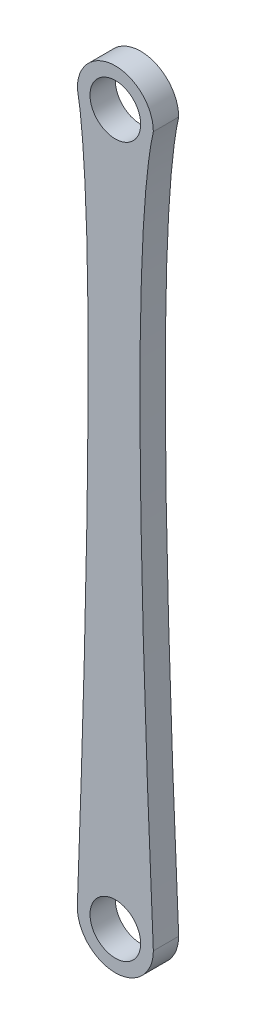
ISO-10303-21;
HEADER;
FILE_DESCRIPTION(('STEP AP214'),'2;1');
FILE_NAME('part.step','',(''),(''),'','','');
FILE_SCHEMA(('AUTOMOTIVE_DESIGN { 1 0 10303 214 1 1 1 1 }'));
ENDSEC;
DATA;
#1=APPLICATION_CONTEXT('core data for automotive mechanical design processes');
#2=APPLICATION_PROTOCOL_DEFINITION('international standard','automotive_design',2000,#1);
#3=PRODUCT_CONTEXT('',#1,'mechanical');
#4=PRODUCT('Part','Part','',(#3));
#5=PRODUCT_RELATED_PRODUCT_CATEGORY('part','',(#4));
#6=PRODUCT_DEFINITION_FORMATION('','',#4);
#7=PRODUCT_DEFINITION_CONTEXT('part definition',#1,'design');
#8=PRODUCT_DEFINITION('design','',#6,#7);
#9=PRODUCT_DEFINITION_SHAPE('','',#8);
#10=(LENGTH_UNIT() NAMED_UNIT(*) SI_UNIT(.MILLI.,.METRE.));
#11=(NAMED_UNIT(*) PLANE_ANGLE_UNIT() SI_UNIT($,.RADIAN.));
#12=(NAMED_UNIT(*) SI_UNIT($,.STERADIAN.) SOLID_ANGLE_UNIT());
#13=UNCERTAINTY_MEASURE_WITH_UNIT(LENGTH_MEASURE(1.E-05),#10,'distance_accuracy_value','');
#14=(GEOMETRIC_REPRESENTATION_CONTEXT(3) GLOBAL_UNCERTAINTY_ASSIGNED_CONTEXT((#13)) GLOBAL_UNIT_ASSIGNED_CONTEXT((#10,
#11,#12)) REPRESENTATION_CONTEXT('',''));
#15=CARTESIAN_POINT('',(0.,0.,0.));
#16=DIRECTION('',(0.,0.,1.));
#17=DIRECTION('',(1.,0.,0.));
#18=AXIS2_PLACEMENT_3D('',#15,#16,#17);
#19=CARTESIAN_POINT('',(-10.7113308739503,111.606684096733,10.));
#20=DIRECTION('',(0.,0.,1.));
#21=DIRECTION('',(1.,0.,0.));
#22=AXIS2_PLACEMENT_3D('',#19,#20,#21);
#23=PLANE('',#22);
#24=CARTESIAN_POINT('',(0.,-75.2678433281264,10.));
#25=DIRECTION('',(0.,0.,1.));
#26=DIRECTION('',(1.,0.,0.));
#27=AXIS2_PLACEMENT_3D('',#24,#25,#26);
#28=CIRCLE('',#27,10.);
#29=CARTESIAN_POINT('',(10.,-75.2678433281264,10.));
#30=VERTEX_POINT('',#29);
#31=EDGE_CURVE('E144',#30,#30,#28,.T.);
#32=ORIENTED_EDGE('',*,*,#31,.F.);
#33=EDGE_LOOP('',(#32));
#34=FACE_BOUND('',#33,.T.);
#35=CARTESIAN_POINT('',(-15.,204.732156671874,10.));
#36=CARTESIAN_POINT('',(-6.42266174790062,158.481211521592,10.));
#37=CARTESIAN_POINT('',(-15.,-75.2678433281266,10.));
#38=B_SPLINE_CURVE_WITH_KNOTS('',2,(#35,#36,#37),.UNSPECIFIED.,.F.,.F.,(3,3),(0.,1.),.UNSPECIFIED.);
#39=CARTESIAN_POINT('',(-15.,204.732156671874,10.));
#40=VERTEX_POINT('',#39);
#41=CARTESIAN_POINT('',(-15.,-75.2678433281264,10.));
#42=VERTEX_POINT('',#41);
#43=EDGE_CURVE('E86',#40,#42,#38,.T.);
#44=ORIENTED_EDGE('',*,*,#43,.T.);
#45=CARTESIAN_POINT('',(0.,-75.2678433281264,10.));
#46=DIRECTION('',(0.,0.,1.));
#47=DIRECTION('',(1.,0.,0.));
#48=AXIS2_PLACEMENT_3D('',#45,#46,#47);
#49=CIRCLE('',#48,15.);
#50=CARTESIAN_POINT('',(15.,-75.2678433281264,10.));
#51=VERTEX_POINT('',#50);
#52=EDGE_CURVE('E81',#42,#51,#49,.T.);
#53=ORIENTED_EDGE('',*,*,#52,.T.);
#54=CARTESIAN_POINT('',(15.,-75.2678433281264,10.));
#55=CARTESIAN_POINT('',(4.42383530771582,157.931962061811,10.));
#56=CARTESIAN_POINT('',(15.,204.732156671874,10.));
#57=B_SPLINE_CURVE_WITH_KNOTS('',2,(#54,#55,#56),.UNSPECIFIED.,.F.,.F.,(3,3),(0.,1.),.UNSPECIFIED.);
#58=CARTESIAN_POINT('',(15.,204.732156671874,10.));
#59=VERTEX_POINT('',#58);
#60=EDGE_CURVE('E84',#51,#59,#57,.T.);
#61=ORIENTED_EDGE('',*,*,#60,.T.);
#62=CARTESIAN_POINT('',(0.,204.732156671874,10.));
#63=DIRECTION('',(0.,0.,1.));
#64=DIRECTION('',(1.,0.,0.));
#65=AXIS2_PLACEMENT_3D('',#62,#63,#64);
#66=CIRCLE('',#65,15.);
#67=EDGE_CURVE('E51',#59,#40,#66,.T.);
#68=ORIENTED_EDGE('',*,*,#67,.T.);
#69=EDGE_LOOP('',(#44,#53,#61,#68));
#70=FACE_BOUND('',#69,.T.);
#71=CARTESIAN_POINT('',(0.,204.732156671874,10.));
#72=DIRECTION('',(0.,0.,1.));
#73=DIRECTION('',(1.,0.,0.));
#74=AXIS2_PLACEMENT_3D('',#71,#72,#73);
#75=CIRCLE('',#74,10.);
#76=CARTESIAN_POINT('',(9.99999999999997,204.732156671874,10.));
#77=VERTEX_POINT('',#76);
#78=EDGE_CURVE('E135',#77,#77,#75,.T.);
#79=ORIENTED_EDGE('',*,*,#78,.F.);
#80=EDGE_LOOP('',(#79));
#81=FACE_BOUND('',#80,.T.);
#82=ADVANCED_FACE('F33',(#34,#70,#81),#23,.T.);
#83=CARTESIAN_POINT('',(-10.7113308739503,111.606684096733,0.));
#84=DIRECTION('',(0.,0.,1.));
#85=DIRECTION('',(1.,0.,0.));
#86=AXIS2_PLACEMENT_3D('',#83,#84,#85);
#87=PLANE('',#86);
#88=CARTESIAN_POINT('',(-15.,204.732156671874,0.));
#89=CARTESIAN_POINT('',(-6.42266174790062,158.481211521592,0.));
#90=CARTESIAN_POINT('',(-15.,-75.2678433281266,0.));
#91=B_SPLINE_CURVE_WITH_KNOTS('',2,(#88,#89,#90),.UNSPECIFIED.,.F.,.F.,(3,3),(0.,1.),.UNSPECIFIED.);
#92=CARTESIAN_POINT('',(-15.,204.732156671874,0.));
#93=VERTEX_POINT('',#92);
#94=CARTESIAN_POINT('',(-15.,-75.2678433281264,0.));
#95=VERTEX_POINT('',#94);
#96=EDGE_CURVE('E147',#93,#95,#91,.T.);
#97=ORIENTED_EDGE('',*,*,#96,.F.);
#98=CARTESIAN_POINT('',(0.,204.732156671874,0.));
#99=DIRECTION('',(0.,0.,1.));
#100=DIRECTION('',(1.,0.,0.));
#101=AXIS2_PLACEMENT_3D('',#98,#99,#100);
#102=CIRCLE('',#101,15.);
#103=CARTESIAN_POINT('',(15.,204.732156671874,0.));
#104=VERTEX_POINT('',#103);
#105=EDGE_CURVE('E74',#104,#93,#102,.T.);
#106=ORIENTED_EDGE('',*,*,#105,.F.);
#107=CARTESIAN_POINT('',(15.,-75.2678433281264,0.));
#108=CARTESIAN_POINT('',(4.42383530771582,157.931962061811,0.));
#109=CARTESIAN_POINT('',(15.,204.732156671874,0.));
#110=B_SPLINE_CURVE_WITH_KNOTS('',2,(#107,#108,#109),.UNSPECIFIED.,.F.,.F.,(3,3),(0.,1.),.UNSPECIFIED.);
#111=CARTESIAN_POINT('',(15.,-75.2678433281264,0.));
#112=VERTEX_POINT('',#111);
#113=EDGE_CURVE('E68',#112,#104,#110,.T.);
#114=ORIENTED_EDGE('',*,*,#113,.F.);
#115=CARTESIAN_POINT('',(0.,-75.2678433281264,0.));
#116=DIRECTION('',(0.,0.,1.));
#117=DIRECTION('',(1.,0.,0.));
#118=AXIS2_PLACEMENT_3D('',#115,#116,#117);
#119=CIRCLE('',#118,15.);
#120=EDGE_CURVE('E90',#95,#112,#119,.T.);
#121=ORIENTED_EDGE('',*,*,#120,.F.);
#122=EDGE_LOOP('',(#97,#106,#114,#121));
#123=FACE_BOUND('',#122,.T.);
#124=CARTESIAN_POINT('',(0.,-75.2678433281264,0.));
#125=DIRECTION('',(0.,0.,1.));
#126=DIRECTION('',(1.,0.,0.));
#127=AXIS2_PLACEMENT_3D('',#124,#125,#126);
#128=CIRCLE('',#127,10.);
#129=CARTESIAN_POINT('',(10.,-75.2678433281264,0.));
#130=VERTEX_POINT('',#129);
#131=EDGE_CURVE('E141',#130,#130,#128,.T.);
#132=ORIENTED_EDGE('',*,*,#131,.T.);
#133=EDGE_LOOP('',(#132));
#134=FACE_BOUND('',#133,.T.);
#135=CARTESIAN_POINT('',(0.,204.732156671874,0.));
#136=DIRECTION('',(0.,0.,1.));
#137=DIRECTION('',(1.,0.,0.));
#138=AXIS2_PLACEMENT_3D('',#135,#136,#137);
#139=CIRCLE('',#138,10.);
#140=CARTESIAN_POINT('',(9.99999999999997,204.732156671874,0.));
#141=VERTEX_POINT('',#140);
#142=EDGE_CURVE('E138',#141,#141,#139,.T.);
#143=ORIENTED_EDGE('',*,*,#142,.T.);
#144=EDGE_LOOP('',(#143));
#145=FACE_BOUND('',#144,.T.);
#146=ADVANCED_FACE('F112',(#123,#134,#145),#87,.F.);
#147=DIRECTION('',(0.,0.,-1.));
#148=VECTOR('',#147,1.);
#149=SURFACE_OF_LINEAR_EXTRUSION('',#38,#148);
#150=ORIENTED_EDGE('',*,*,#96,.T.);
#151=DIRECTION('',(0.,0.,-1.));
#152=VECTOR('',#151,1.);
#153=CARTESIAN_POINT('',(-15.,-75.2678433281264,10.));
#154=LINE('',#153,#152);
#155=EDGE_CURVE('E11',#42,#95,#154,.T.);
#156=ORIENTED_EDGE('',*,*,#155,.F.);
#157=ORIENTED_EDGE('',*,*,#43,.F.);
#158=DIRECTION('',(0.,0.,-1.));
#159=VECTOR('',#158,1.);
#160=CARTESIAN_POINT('',(-15.,204.732156671874,10.));
#161=LINE('',#160,#159);
#162=EDGE_CURVE('E94',#40,#93,#161,.T.);
#163=ORIENTED_EDGE('',*,*,#162,.T.);
#164=EDGE_LOOP('',(#150,#156,#157,#163));
#165=FACE_BOUND('',#164,.T.);
#166=ADVANCED_FACE('F35',(#165),#149,.F.);
#167=CARTESIAN_POINT('',(0.,-75.2678433281264,10.));
#168=DIRECTION('',(0.,0.,-1.));
#169=DIRECTION('',(-1.,0.,0.));
#170=AXIS2_PLACEMENT_3D('',#167,#168,#169);
#171=CYLINDRICAL_SURFACE('',#170,15.);
#172=ORIENTED_EDGE('',*,*,#120,.T.);
#173=DIRECTION('',(0.,0.,-1.));
#174=VECTOR('',#173,1.);
#175=CARTESIAN_POINT('',(15.,-75.2678433281264,10.));
#176=LINE('',#175,#174);
#177=EDGE_CURVE('E43',#51,#112,#176,.T.);
#178=ORIENTED_EDGE('',*,*,#177,.F.);
#179=ORIENTED_EDGE('',*,*,#52,.F.);
#180=ORIENTED_EDGE('',*,*,#155,.T.);
#181=EDGE_LOOP('',(#172,#178,#179,#180));
#182=FACE_BOUND('',#181,.T.);
#183=ADVANCED_FACE('F89',(#182),#171,.T.);
#184=DIRECTION('',(0.,0.,-1.));
#185=VECTOR('',#184,1.);
#186=SURFACE_OF_LINEAR_EXTRUSION('',#57,#185);
#187=ORIENTED_EDGE('',*,*,#113,.T.);
#188=DIRECTION('',(0.,0.,-1.));
#189=VECTOR('',#188,1.);
#190=CARTESIAN_POINT('',(15.,204.732156671874,10.));
#191=LINE('',#190,#189);
#192=EDGE_CURVE('E91',#59,#104,#191,.T.);
#193=ORIENTED_EDGE('',*,*,#192,.F.);
#194=ORIENTED_EDGE('',*,*,#60,.F.);
#195=ORIENTED_EDGE('',*,*,#177,.T.);
#196=EDGE_LOOP('',(#187,#193,#194,#195));
#197=FACE_BOUND('',#196,.T.);
#198=ADVANCED_FACE('F92',(#197),#186,.F.);
#199=CARTESIAN_POINT('',(0.,204.732156671874,10.));
#200=DIRECTION('',(0.,0.,-1.));
#201=DIRECTION('',(-1.,0.,0.));
#202=AXIS2_PLACEMENT_3D('',#199,#200,#201);
#203=CYLINDRICAL_SURFACE('',#202,15.);
#204=ORIENTED_EDGE('',*,*,#105,.T.);
#205=ORIENTED_EDGE('',*,*,#162,.F.);
#206=ORIENTED_EDGE('',*,*,#67,.F.);
#207=ORIENTED_EDGE('',*,*,#192,.T.);
#208=EDGE_LOOP('',(#204,#205,#206,#207));
#209=FACE_BOUND('',#208,.T.);
#210=ADVANCED_FACE('F106',(#209),#203,.T.);
#211=CARTESIAN_POINT('',(0.,-75.2678433281264,10.));
#212=DIRECTION('',(0.,0.,-1.));
#213=DIRECTION('',(-1.,0.,0.));
#214=AXIS2_PLACEMENT_3D('',#211,#212,#213);
#215=CYLINDRICAL_SURFACE('',#214,10.);
#216=ORIENTED_EDGE('',*,*,#31,.T.);
#217=EDGE_LOOP('',(#216));
#218=FACE_BOUND('',#217,.T.);
#219=ORIENTED_EDGE('',*,*,#131,.F.);
#220=EDGE_LOOP('',(#219));
#221=FACE_BOUND('',#220,.T.);
#222=ADVANCED_FACE('F123',(#218,#221),#215,.F.);
#223=CARTESIAN_POINT('',(0.,204.732156671874,10.));
#224=DIRECTION('',(0.,0.,-1.));
#225=DIRECTION('',(-1.,0.,0.));
#226=AXIS2_PLACEMENT_3D('',#223,#224,#225);
#227=CYLINDRICAL_SURFACE('',#226,10.);
#228=ORIENTED_EDGE('',*,*,#78,.T.);
#229=EDGE_LOOP('',(#228));
#230=FACE_BOUND('',#229,.T.);
#231=ORIENTED_EDGE('',*,*,#142,.F.);
#232=EDGE_LOOP('',(#231));
#233=FACE_BOUND('',#232,.T.);
#234=ADVANCED_FACE('F126',(#230,#233),#227,.F.);
#235=CLOSED_SHELL('',(#82,#146,#166,#183,#198,#210,#222,#234));
#236=MANIFOLD_SOLID_BREP('B2',#235);
#237=ADVANCED_BREP_SHAPE_REPRESENTATION('',(#18,#236),#14);
#238=SHAPE_DEFINITION_REPRESENTATION(#9,#237);
ENDSEC;
END-ISO-10303-21;
